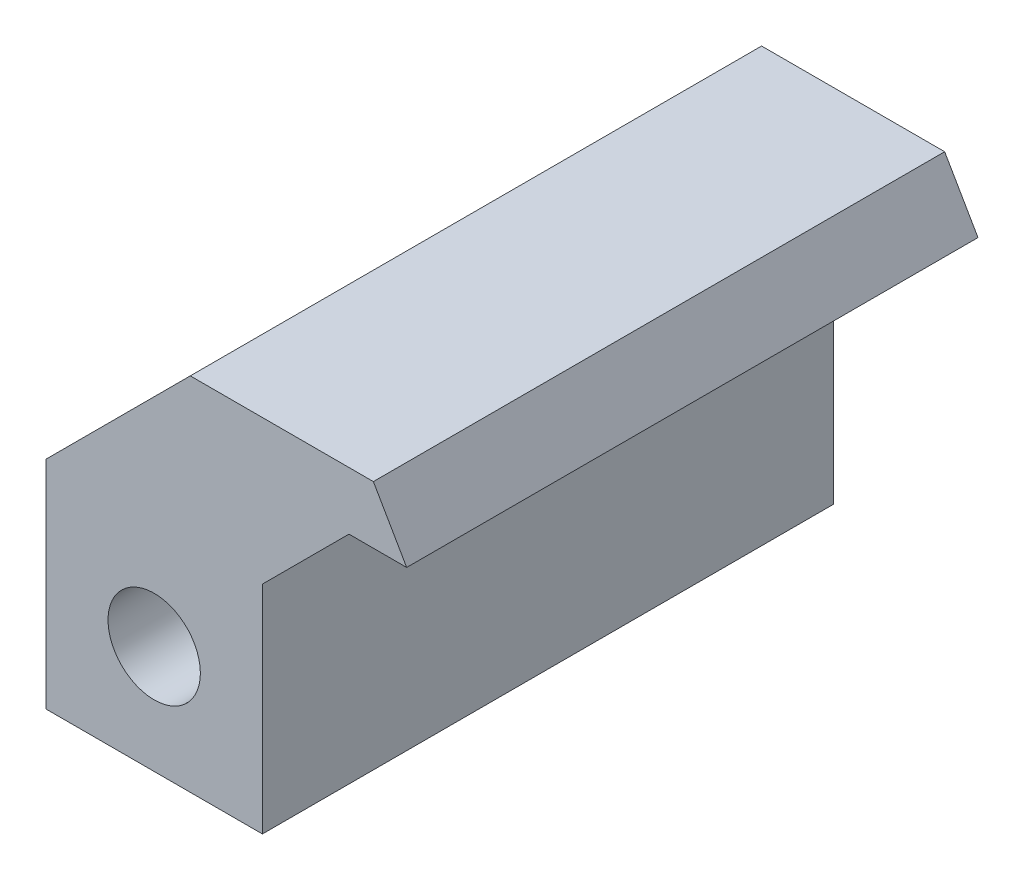
ISO-10303-21;
HEADER;
FILE_DESCRIPTION(('STEP AP214'),'2;1');
FILE_NAME('part.step','',(''),(''),'','','');
FILE_SCHEMA(('AUTOMOTIVE_DESIGN { 1 0 10303 214 1 1 1 1 }'));
ENDSEC;
DATA;
#1=APPLICATION_CONTEXT('core data for automotive mechanical design processes');
#2=APPLICATION_PROTOCOL_DEFINITION('international standard','automotive_design',2000,#1);
#3=PRODUCT_CONTEXT('',#1,'mechanical');
#4=PRODUCT('Part','Part','',(#3));
#5=PRODUCT_RELATED_PRODUCT_CATEGORY('part','',(#4));
#6=PRODUCT_DEFINITION_FORMATION('','',#4);
#7=PRODUCT_DEFINITION_CONTEXT('part definition',#1,'design');
#8=PRODUCT_DEFINITION('design','',#6,#7);
#9=PRODUCT_DEFINITION_SHAPE('','',#8);
#10=(LENGTH_UNIT() NAMED_UNIT(*) SI_UNIT(.MILLI.,.METRE.));
#11=(NAMED_UNIT(*) PLANE_ANGLE_UNIT() SI_UNIT($,.RADIAN.));
#12=(NAMED_UNIT(*) SI_UNIT($,.STERADIAN.) SOLID_ANGLE_UNIT());
#13=UNCERTAINTY_MEASURE_WITH_UNIT(LENGTH_MEASURE(1.E-05),#10,'distance_accuracy_value','');
#14=(GEOMETRIC_REPRESENTATION_CONTEXT(3) GLOBAL_UNCERTAINTY_ASSIGNED_CONTEXT((#13)) GLOBAL_UNIT_ASSIGNED_CONTEXT((#10,
#11,#12)) REPRESENTATION_CONTEXT('',''));
#15=CARTESIAN_POINT('',(0.,0.,0.));
#16=DIRECTION('',(0.,0.,1.));
#17=DIRECTION('',(1.,0.,0.));
#18=AXIS2_PLACEMENT_3D('',#15,#16,#17);
#19=CARTESIAN_POINT('',(3.75,-3.75,-9.9));
#20=DIRECTION('',(1.,0.,0.));
#21=DIRECTION('',(0.,0.,-1.));
#22=AXIS2_PLACEMENT_3D('',#19,#20,#21);
#23=PLANE('',#22);
#24=DIRECTION('',(0.,0.,1.));
#25=VECTOR('',#24,1.);
#26=CARTESIAN_POINT('',(3.75,3.75,-9.9));
#27=LINE('',#26,#25);
#28=CARTESIAN_POINT('',(3.75,3.75,-9.9));
#29=VERTEX_POINT('',#28);
#30=CARTESIAN_POINT('',(3.75,3.75,9.9));
#31=VERTEX_POINT('',#30);
#32=EDGE_CURVE('E36',#29,#31,#27,.T.);
#33=ORIENTED_EDGE('',*,*,#32,.T.);
#34=DIRECTION('',(0.,1.,0.));
#35=VECTOR('',#34,1.);
#36=CARTESIAN_POINT('',(3.75,-3.75,9.9));
#37=LINE('',#36,#35);
#38=CARTESIAN_POINT('',(3.75,-3.75,9.9));
#39=VERTEX_POINT('',#38);
#40=EDGE_CURVE('E147',#39,#31,#37,.T.);
#41=ORIENTED_EDGE('',*,*,#40,.F.);
#42=DIRECTION('',(0.,0.,1.));
#43=VECTOR('',#42,1.);
#44=CARTESIAN_POINT('',(3.75,-3.75,-9.9));
#45=LINE('',#44,#43);
#46=CARTESIAN_POINT('',(3.75,-3.75,-9.9));
#47=VERTEX_POINT('',#46);
#48=EDGE_CURVE('E11',#47,#39,#45,.T.);
#49=ORIENTED_EDGE('',*,*,#48,.F.);
#50=DIRECTION('',(0.,1.,0.));
#51=VECTOR('',#50,1.);
#52=CARTESIAN_POINT('',(3.75,-3.75,-9.9));
#53=LINE('',#52,#51);
#54=EDGE_CURVE('E104',#47,#29,#53,.T.);
#55=ORIENTED_EDGE('',*,*,#54,.T.);
#56=EDGE_LOOP('',(#33,#41,#49,#55));
#57=FACE_BOUND('',#56,.T.);
#58=ADVANCED_FACE('F33',(#57),#23,.T.);
#59=CARTESIAN_POINT('',(-3.75,-3.75,-9.9));
#60=DIRECTION('',(0.,-1.,0.));
#61=DIRECTION('',(0.,0.,-1.));
#62=AXIS2_PLACEMENT_3D('',#59,#60,#61);
#63=PLANE('',#62);
#64=ORIENTED_EDGE('',*,*,#48,.T.);
#65=DIRECTION('',(1.,0.,0.));
#66=VECTOR('',#65,1.);
#67=CARTESIAN_POINT('',(-3.75,-3.75,9.9));
#68=LINE('',#67,#66);
#69=CARTESIAN_POINT('',(-3.75,-3.75,9.9));
#70=VERTEX_POINT('',#69);
#71=EDGE_CURVE('E151',#70,#39,#68,.T.);
#72=ORIENTED_EDGE('',*,*,#71,.F.);
#73=DIRECTION('',(0.,0.,1.));
#74=VECTOR('',#73,1.);
#75=CARTESIAN_POINT('',(-3.75,-3.75,-9.9));
#76=LINE('',#75,#74);
#77=CARTESIAN_POINT('',(-3.75,-3.75,-9.9));
#78=VERTEX_POINT('',#77);
#79=EDGE_CURVE('E41',#78,#70,#76,.T.);
#80=ORIENTED_EDGE('',*,*,#79,.F.);
#81=DIRECTION('',(1.,0.,0.));
#82=VECTOR('',#81,1.);
#83=CARTESIAN_POINT('',(-3.75,-3.75,-9.9));
#84=LINE('',#83,#82);
#85=EDGE_CURVE('E102',#78,#47,#84,.T.);
#86=ORIENTED_EDGE('',*,*,#85,.T.);
#87=EDGE_LOOP('',(#64,#72,#80,#86));
#88=FACE_BOUND('',#87,.T.);
#89=ADVANCED_FACE('F164',(#88),#63,.T.);
#90=CARTESIAN_POINT('',(-3.75,-3.75,-9.9));
#91=DIRECTION('',(-1.,0.,0.));
#92=DIRECTION('',(0.,0.,1.));
#93=AXIS2_PLACEMENT_3D('',#90,#91,#92);
#94=PLANE('',#93);
#95=ORIENTED_EDGE('',*,*,#79,.T.);
#96=DIRECTION('',(0.,-1.,0.));
#97=VECTOR('',#96,1.);
#98=CARTESIAN_POINT('',(-3.75,-3.75,9.9));
#99=LINE('',#98,#97);
#100=CARTESIAN_POINT('',(-3.75,3.75,9.9));
#101=VERTEX_POINT('',#100);
#102=EDGE_CURVE('E110',#101,#70,#99,.T.);
#103=ORIENTED_EDGE('',*,*,#102,.F.);
#104=DIRECTION('',(0.,0.,1.));
#105=VECTOR('',#104,1.);
#106=CARTESIAN_POINT('',(-3.75,3.75,-9.9));
#107=LINE('',#106,#105);
#108=CARTESIAN_POINT('',(-3.75,3.75,-9.9));
#109=VERTEX_POINT('',#108);
#110=EDGE_CURVE('E107',#109,#101,#107,.T.);
#111=ORIENTED_EDGE('',*,*,#110,.F.);
#112=DIRECTION('',(0.,-1.,0.));
#113=VECTOR('',#112,1.);
#114=CARTESIAN_POINT('',(-3.75,-3.75,-9.9));
#115=LINE('',#114,#113);
#116=EDGE_CURVE('E96',#109,#78,#115,.T.);
#117=ORIENTED_EDGE('',*,*,#116,.T.);
#118=EDGE_LOOP('',(#95,#103,#111,#117));
#119=FACE_BOUND('',#118,.T.);
#120=ADVANCED_FACE('F108',(#119),#94,.T.);
#121=CARTESIAN_POINT('',(0.,0.,-9.9));
#122=DIRECTION('',(0.,0.,-1.));
#123=DIRECTION('',(-1.,0.,0.));
#124=AXIS2_PLACEMENT_3D('',#121,#122,#123);
#125=PLANE('',#124);
#126=CARTESIAN_POINT('',(0.,0.,-9.9));
#127=DIRECTION('',(0.,0.,1.));
#128=DIRECTION('',(1.,0.,0.));
#129=AXIS2_PLACEMENT_3D('',#126,#127,#128);
#130=CIRCLE('',#129,1.6);
#131=CARTESIAN_POINT('',(1.6,0.,-9.9));
#132=VERTEX_POINT('',#131);
#133=EDGE_CURVE('E154',#132,#132,#130,.T.);
#134=ORIENTED_EDGE('',*,*,#133,.T.);
#135=EDGE_LOOP('',(#134));
#136=FACE_BOUND('',#135,.T.);
#137=ORIENTED_EDGE('',*,*,#54,.F.);
#138=ORIENTED_EDGE('',*,*,#85,.F.);
#139=ORIENTED_EDGE('',*,*,#116,.F.);
#140=DIRECTION('',(-0.707106781186546,-0.707106781186549,0.));
#141=VECTOR('',#140,1.);
#142=CARTESIAN_POINT('',(1.24999999999998,8.75,-9.9));
#143=LINE('',#142,#141);
#144=CARTESIAN_POINT('',(1.24999999999998,8.75,-9.9));
#145=VERTEX_POINT('',#144);
#146=EDGE_CURVE('E100',#145,#109,#143,.T.);
#147=ORIENTED_EDGE('',*,*,#146,.F.);
#148=DIRECTION('',(-1.,0.,0.));
#149=VECTOR('',#148,1.);
#150=CARTESIAN_POINT('',(7.59529946162072,8.75,-9.9));
#151=LINE('',#150,#149);
#152=CARTESIAN_POINT('',(7.59529946162072,8.75,-9.9));
#153=VERTEX_POINT('',#152);
#154=EDGE_CURVE('E130',#153,#145,#151,.T.);
#155=ORIENTED_EDGE('',*,*,#154,.F.);
#156=DIRECTION('',(-0.500000000000004,0.866025403784436,0.));
#157=VECTOR('',#156,1.);
#158=CARTESIAN_POINT('',(8.74999999999999,6.75,-9.9));
#159=LINE('',#158,#157);
#160=CARTESIAN_POINT('',(8.74999999999999,6.75,-9.9));
#161=VERTEX_POINT('',#160);
#162=EDGE_CURVE('E133',#161,#153,#159,.T.);
#163=ORIENTED_EDGE('',*,*,#162,.F.);
#164=DIRECTION('',(1.,0.,0.));
#165=VECTOR('',#164,1.);
#166=CARTESIAN_POINT('',(6.74999999999999,6.75,-9.9));
#167=LINE('',#166,#165);
#168=CARTESIAN_POINT('',(6.74999999999999,6.75,-9.9));
#169=VERTEX_POINT('',#168);
#170=EDGE_CURVE('E137',#169,#161,#167,.T.);
#171=ORIENTED_EDGE('',*,*,#170,.F.);
#172=DIRECTION('',(0.707106781186546,0.707106781186549,0.));
#173=VECTOR('',#172,1.);
#174=CARTESIAN_POINT('',(3.75,3.75,-9.9));
#175=LINE('',#174,#173);
#176=EDGE_CURVE('E117',#29,#169,#175,.T.);
#177=ORIENTED_EDGE('',*,*,#176,.F.);
#178=EDGE_LOOP('',(#137,#138,#139,#147,#155,#163,#171,#177));
#179=FACE_BOUND('',#178,.T.);
#180=ADVANCED_FACE('F98',(#136,#179),#125,.T.);
#181=CARTESIAN_POINT('',(0.,0.,-9.9));
#182=DIRECTION('',(0.,0.,1.));
#183=DIRECTION('',(1.,0.,0.));
#184=AXIS2_PLACEMENT_3D('',#181,#182,#183);
#185=CYLINDRICAL_SURFACE('',#184,1.6);
#186=CARTESIAN_POINT('',(0.,0.,9.9));
#187=DIRECTION('',(0.,0.,1.));
#188=DIRECTION('',(1.,0.,0.));
#189=AXIS2_PLACEMENT_3D('',#186,#187,#188);
#190=CIRCLE('',#189,1.6);
#191=CARTESIAN_POINT('',(1.6,0.,9.9));
#192=VERTEX_POINT('',#191);
#193=EDGE_CURVE('E144',#192,#192,#190,.T.);
#194=CARTESIAN_POINT('',(1.6,0.,-9.9));
#195=CARTESIAN_POINT('',(1.6,0.,-9.69375));
#196=CARTESIAN_POINT('',(1.6,0.,-9.4875));
#197=CARTESIAN_POINT('',(1.6,0.,-9.075));
#198=CARTESIAN_POINT('',(1.6,0.,-8.86875));
#199=CARTESIAN_POINT('',(1.6,0.,-8.45625));
#200=CARTESIAN_POINT('',(1.6,0.,-8.25));
#201=CARTESIAN_POINT('',(1.6,0.,-7.8375));
#202=CARTESIAN_POINT('',(1.6,0.,-7.63125));
#203=CARTESIAN_POINT('',(1.6,0.,-7.21875));
#204=CARTESIAN_POINT('',(1.6,0.,-7.0125));
#205=CARTESIAN_POINT('',(1.6,0.,-6.6));
#206=CARTESIAN_POINT('',(1.6,0.,-6.39375));
#207=CARTESIAN_POINT('',(1.6,0.,-5.98125));
#208=CARTESIAN_POINT('',(1.6,0.,-5.775));
#209=CARTESIAN_POINT('',(1.6,0.,-5.3625));
#210=CARTESIAN_POINT('',(1.6,0.,-5.15625));
#211=CARTESIAN_POINT('',(1.6,0.,-4.74375));
#212=CARTESIAN_POINT('',(1.6,0.,-4.5375));
#213=CARTESIAN_POINT('',(1.6,0.,-4.125));
#214=CARTESIAN_POINT('',(1.6,0.,-3.91875));
#215=CARTESIAN_POINT('',(1.6,0.,-3.50625));
#216=CARTESIAN_POINT('',(1.6,0.,-3.3));
#217=CARTESIAN_POINT('',(1.6,0.,-2.8875));
#218=CARTESIAN_POINT('',(1.6,0.,-2.68125));
#219=CARTESIAN_POINT('',(1.6,0.,-2.26875));
#220=CARTESIAN_POINT('',(1.6,0.,-2.0625));
#221=CARTESIAN_POINT('',(1.6,0.,-1.65));
#222=CARTESIAN_POINT('',(1.6,0.,-1.44375));
#223=CARTESIAN_POINT('',(1.6,0.,-1.03125));
#224=CARTESIAN_POINT('',(1.6,0.,-0.825));
#225=CARTESIAN_POINT('',(1.6,0.,-0.4125));
#226=CARTESIAN_POINT('',(1.6,0.,-0.20625));
#227=CARTESIAN_POINT('',(1.6,0.,0.20625));
#228=CARTESIAN_POINT('',(1.6,0.,0.4125));
#229=CARTESIAN_POINT('',(1.6,0.,0.825));
#230=CARTESIAN_POINT('',(1.6,0.,1.03125));
#231=CARTESIAN_POINT('',(1.6,0.,1.44375));
#232=CARTESIAN_POINT('',(1.6,0.,1.65));
#233=CARTESIAN_POINT('',(1.6,0.,2.0625));
#234=CARTESIAN_POINT('',(1.6,0.,2.26875));
#235=CARTESIAN_POINT('',(1.6,0.,2.68125));
#236=CARTESIAN_POINT('',(1.6,0.,2.8875));
#237=CARTESIAN_POINT('',(1.6,0.,3.3));
#238=CARTESIAN_POINT('',(1.6,0.,3.50625));
#239=CARTESIAN_POINT('',(1.6,0.,3.91875));
#240=CARTESIAN_POINT('',(1.6,0.,4.125));
#241=CARTESIAN_POINT('',(1.6,0.,4.5375));
#242=CARTESIAN_POINT('',(1.6,0.,4.74375));
#243=CARTESIAN_POINT('',(1.6,0.,5.15625));
#244=CARTESIAN_POINT('',(1.6,0.,5.3625));
#245=CARTESIAN_POINT('',(1.6,0.,5.775));
#246=CARTESIAN_POINT('',(1.6,0.,5.98125));
#247=CARTESIAN_POINT('',(1.6,0.,6.39375));
#248=CARTESIAN_POINT('',(1.6,0.,6.6));
#249=CARTESIAN_POINT('',(1.6,0.,7.0125));
#250=CARTESIAN_POINT('',(1.6,0.,7.21875));
#251=CARTESIAN_POINT('',(1.6,0.,7.63125));
#252=CARTESIAN_POINT('',(1.6,0.,7.8375));
#253=CARTESIAN_POINT('',(1.6,0.,8.25));
#254=CARTESIAN_POINT('',(1.6,0.,8.45625));
#255=CARTESIAN_POINT('',(1.6,0.,8.86875));
#256=CARTESIAN_POINT('',(1.6,0.,9.075));
#257=CARTESIAN_POINT('',(1.6,0.,9.4875));
#258=CARTESIAN_POINT('',(1.6,0.,9.69375));
#259=CARTESIAN_POINT('',(1.6,0.,9.9));
#260=B_SPLINE_CURVE_WITH_KNOTS('',3,(#194,#195,#196,#197,#198,#199,#200,#201,#202,#203,#204,
#205,#206,#207,#208,#209,#210,#211,#212,#213,#214,#215,#216,#217,#218,#219,#220,#221,#222,#223,
#224,#225,#226,#227,#228,#229,#230,#231,#232,#233,#234,#235,#236,#237,#238,#239,#240,#241,#242,
#243,#244,#245,#246,#247,#248,#249,#250,#251,#252,#253,#254,#255,#256,#257,#258,#259),
.UNSPECIFIED.,.F.,.F.,(4,2,2,2,2,2,2,2,2,2,2,2,2,2,2,2,2,2,2,2,2,2,2,2,2,2,2,2,2,2,2,2,4),(0.,
0.618749999999999,1.2375,1.85625,2.475,3.09375,3.7125,4.33125,4.95,5.56875,6.1875,6.80625,7.425,
8.04375,8.6625,9.28125,9.9,10.51875,11.1375,11.75625,12.375,12.99375,13.6125,14.23125,14.85,
15.46875,16.0875,16.70625,17.325,17.94375,18.5625,19.18125,19.8),.UNSPECIFIED.);
#261=EDGE_CURVE('BSEAM176',#132,#192,#260,.T.);
#262=ORIENTED_EDGE('',*,*,#133,.F.);
#263=ORIENTED_EDGE('',*,*,#193,.T.);
#264=ORIENTED_EDGE('',*,*,#261,.T.);
#265=ORIENTED_EDGE('',*,*,#261,.F.);
#266=EDGE_LOOP('',(#262,#264,#263,#265));
#267=FACE_BOUND('',#266,.T.);
#268=ADVANCED_FACE('F176',(#267),#185,.F.);
#269=CARTESIAN_POINT('',(0.,0.,9.9));
#270=DIRECTION('',(0.,0.,-1.));
#271=DIRECTION('',(-1.,0.,0.));
#272=AXIS2_PLACEMENT_3D('',#269,#270,#271);
#273=PLANE('',#272);
#274=ORIENTED_EDGE('',*,*,#40,.T.);
#275=DIRECTION('',(0.707106781186546,0.707106781186549,0.));
#276=VECTOR('',#275,1.);
#277=CARTESIAN_POINT('',(3.75,3.75,9.9));
#278=LINE('',#277,#276);
#279=CARTESIAN_POINT('',(6.74999999999999,6.75,9.9));
#280=VERTEX_POINT('',#279);
#281=EDGE_CURVE('E213',#31,#280,#278,.T.);
#282=ORIENTED_EDGE('',*,*,#281,.T.);
#283=DIRECTION('',(1.,0.,0.));
#284=VECTOR('',#283,1.);
#285=CARTESIAN_POINT('',(6.74999999999999,6.75,9.9));
#286=LINE('',#285,#284);
#287=CARTESIAN_POINT('',(8.74999999999999,6.75,9.9));
#288=VERTEX_POINT('',#287);
#289=EDGE_CURVE('E124',#280,#288,#286,.T.);
#290=ORIENTED_EDGE('',*,*,#289,.T.);
#291=DIRECTION('',(-0.500000000000004,0.866025403784436,0.));
#292=VECTOR('',#291,1.);
#293=CARTESIAN_POINT('',(8.74999999999999,6.75,9.9));
#294=LINE('',#293,#292);
#295=CARTESIAN_POINT('',(7.59529946162072,8.75,9.9));
#296=VERTEX_POINT('',#295);
#297=EDGE_CURVE('E118',#288,#296,#294,.T.);
#298=ORIENTED_EDGE('',*,*,#297,.T.);
#299=DIRECTION('',(-1.,0.,0.));
#300=VECTOR('',#299,1.);
#301=CARTESIAN_POINT('',(7.59529946162072,8.75,9.9));
#302=LINE('',#301,#300);
#303=CARTESIAN_POINT('',(1.24999999999998,8.75,9.9));
#304=VERTEX_POINT('',#303);
#305=EDGE_CURVE('E128',#296,#304,#302,.T.);
#306=ORIENTED_EDGE('',*,*,#305,.T.);
#307=DIRECTION('',(-0.707106781186546,-0.707106781186549,0.));
#308=VECTOR('',#307,1.);
#309=CARTESIAN_POINT('',(1.24999999999998,8.75,9.9));
#310=LINE('',#309,#308);
#311=EDGE_CURVE('E163',#304,#101,#310,.T.);
#312=ORIENTED_EDGE('',*,*,#311,.T.);
#313=ORIENTED_EDGE('',*,*,#102,.T.);
#314=ORIENTED_EDGE('',*,*,#71,.T.);
#315=EDGE_LOOP('',(#274,#282,#290,#298,#306,#312,#313,#314));
#316=FACE_BOUND('',#315,.T.);
#317=ORIENTED_EDGE('',*,*,#193,.F.);
#318=EDGE_LOOP('',(#317));
#319=FACE_BOUND('',#318,.T.);
#320=ADVANCED_FACE('F160',(#316,#319),#273,.F.);
#321=CARTESIAN_POINT('',(1.24999999999998,8.75,-23.3629120178363));
#322=DIRECTION('',(-0.707106781186549,0.707106781186546,0.));
#323=DIRECTION('',(-0.707106781186546,-0.707106781186549,0.));
#324=AXIS2_PLACEMENT_3D('',#321,#322,#323);
#325=PLANE('',#324);
#326=DIRECTION('',(0.,0.,1.));
#327=VECTOR('',#326,1.);
#328=CARTESIAN_POINT('',(1.24999999999998,8.75,-23.3629120178363));
#329=LINE('',#328,#327);
#330=EDGE_CURVE('E116',#145,#304,#329,.T.);
#331=ORIENTED_EDGE('',*,*,#330,.F.);
#332=ORIENTED_EDGE('',*,*,#146,.T.);
#333=ORIENTED_EDGE('',*,*,#110,.T.);
#334=ORIENTED_EDGE('',*,*,#311,.F.);
#335=EDGE_LOOP('',(#331,#332,#333,#334));
#336=FACE_BOUND('',#335,.T.);
#337=ADVANCED_FACE('F115',(#336),#325,.T.);
#338=CARTESIAN_POINT('',(3.75,3.75,-23.3629120178363));
#339=DIRECTION('',(0.707106781186549,-0.707106781186546,0.));
#340=DIRECTION('',(0.707106781186546,0.707106781186549,0.));
#341=AXIS2_PLACEMENT_3D('',#338,#339,#340);
#342=PLANE('',#341);
#343=ORIENTED_EDGE('',*,*,#32,.F.);
#344=ORIENTED_EDGE('',*,*,#176,.T.);
#345=DIRECTION('',(0.,0.,1.));
#346=VECTOR('',#345,1.);
#347=CARTESIAN_POINT('',(6.74999999999999,6.75,-23.3629120178363));
#348=LINE('',#347,#346);
#349=EDGE_CURVE('E121',#169,#280,#348,.T.);
#350=ORIENTED_EDGE('',*,*,#349,.T.);
#351=ORIENTED_EDGE('',*,*,#281,.F.);
#352=EDGE_LOOP('',(#343,#344,#350,#351));
#353=FACE_BOUND('',#352,.T.);
#354=ADVANCED_FACE('F185',(#353),#342,.T.);
#355=CARTESIAN_POINT('',(6.74999999999999,6.75,-23.3629120178363));
#356=DIRECTION('',(0.,-1.,0.));
#357=DIRECTION('',(0.,0.,-1.));
#358=AXIS2_PLACEMENT_3D('',#355,#356,#357);
#359=PLANE('',#358);
#360=ORIENTED_EDGE('',*,*,#349,.F.);
#361=ORIENTED_EDGE('',*,*,#170,.T.);
#362=DIRECTION('',(0.,0.,1.));
#363=VECTOR('',#362,1.);
#364=CARTESIAN_POINT('',(8.74999999999999,6.75,-23.3629120178363));
#365=LINE('',#364,#363);
#366=EDGE_CURVE('E136',#161,#288,#365,.T.);
#367=ORIENTED_EDGE('',*,*,#366,.T.);
#368=ORIENTED_EDGE('',*,*,#289,.F.);
#369=EDGE_LOOP('',(#360,#361,#367,#368));
#370=FACE_BOUND('',#369,.T.);
#371=ADVANCED_FACE('F188',(#370),#359,.T.);
#372=CARTESIAN_POINT('',(8.74999999999999,6.75,-23.3629120178363));
#373=DIRECTION('',(0.866025403784436,0.500000000000004,0.));
#374=DIRECTION('',(-0.500000000000004,0.866025403784436,0.));
#375=AXIS2_PLACEMENT_3D('',#372,#373,#374);
#376=PLANE('',#375);
#377=ORIENTED_EDGE('',*,*,#366,.F.);
#378=ORIENTED_EDGE('',*,*,#162,.T.);
#379=DIRECTION('',(0.,0.,1.));
#380=VECTOR('',#379,1.);
#381=CARTESIAN_POINT('',(7.59529946162072,8.75,-23.3629120178363));
#382=LINE('',#381,#380);
#383=EDGE_CURVE('E132',#153,#296,#382,.T.);
#384=ORIENTED_EDGE('',*,*,#383,.T.);
#385=ORIENTED_EDGE('',*,*,#297,.F.);
#386=EDGE_LOOP('',(#377,#378,#384,#385));
#387=FACE_BOUND('',#386,.T.);
#388=ADVANCED_FACE('F192',(#387),#376,.T.);
#389=CARTESIAN_POINT('',(7.59529946162072,8.75,-23.3629120178363));
#390=DIRECTION('',(0.,1.,0.));
#391=DIRECTION('',(0.,0.,1.));
#392=AXIS2_PLACEMENT_3D('',#389,#390,#391);
#393=PLANE('',#392);
#394=ORIENTED_EDGE('',*,*,#383,.F.);
#395=ORIENTED_EDGE('',*,*,#154,.T.);
#396=ORIENTED_EDGE('',*,*,#330,.T.);
#397=ORIENTED_EDGE('',*,*,#305,.F.);
#398=EDGE_LOOP('',(#394,#395,#396,#397));
#399=FACE_BOUND('',#398,.T.);
#400=ADVANCED_FACE('F196',(#399),#393,.T.);
#401=CLOSED_SHELL('',(#58,#89,#120,#180,#268,#320,#337,#354,#371,#388,#400));
#402=MANIFOLD_SOLID_BREP('B2',#401);
#403=ADVANCED_BREP_SHAPE_REPRESENTATION('',(#18,#402),#14);
#404=SHAPE_DEFINITION_REPRESENTATION(#9,#403);
ENDSEC;
END-ISO-10303-21;
